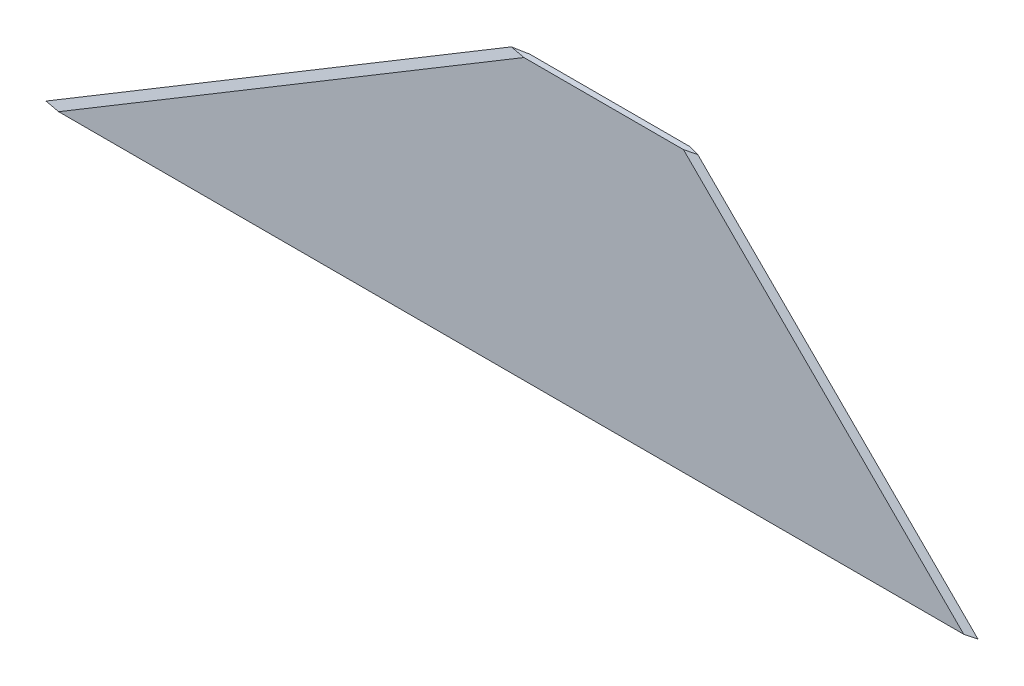
ISO-10303-21;
HEADER;
FILE_DESCRIPTION(('STEP AP214'),'2;1');
FILE_NAME('part.step','',(''),(''),'','','');
FILE_SCHEMA(('AUTOMOTIVE_DESIGN { 1 0 10303 214 1 1 1 1 }'));
ENDSEC;
DATA;
#1=APPLICATION_CONTEXT('core data for automotive mechanical design processes');
#2=APPLICATION_PROTOCOL_DEFINITION('international standard','automotive_design',2000,#1);
#3=PRODUCT_CONTEXT('',#1,'mechanical');
#4=PRODUCT('Part','Part','',(#3));
#5=PRODUCT_RELATED_PRODUCT_CATEGORY('part','',(#4));
#6=PRODUCT_DEFINITION_FORMATION('','',#4);
#7=PRODUCT_DEFINITION_CONTEXT('part definition',#1,'design');
#8=PRODUCT_DEFINITION('design','',#6,#7);
#9=PRODUCT_DEFINITION_SHAPE('','',#8);
#10=(LENGTH_UNIT() NAMED_UNIT(*) SI_UNIT(.MILLI.,.METRE.));
#11=(NAMED_UNIT(*) PLANE_ANGLE_UNIT() SI_UNIT($,.RADIAN.));
#12=(NAMED_UNIT(*) SI_UNIT($,.STERADIAN.) SOLID_ANGLE_UNIT());
#13=UNCERTAINTY_MEASURE_WITH_UNIT(LENGTH_MEASURE(1.E-05),#10,'distance_accuracy_value','');
#14=(GEOMETRIC_REPRESENTATION_CONTEXT(3) GLOBAL_UNCERTAINTY_ASSIGNED_CONTEXT((#13)) GLOBAL_UNIT_ASSIGNED_CONTEXT((#10,
#11,#12)) REPRESENTATION_CONTEXT('',''));
#15=CARTESIAN_POINT('',(0.,0.,0.));
#16=DIRECTION('',(0.,0.,1.));
#17=DIRECTION('',(1.,0.,0.));
#18=AXIS2_PLACEMENT_3D('',#15,#16,#17);
#19=CARTESIAN_POINT('',(-508.,0.,3.175));
#20=DIRECTION('',(0.,1.,0.));
#21=DIRECTION('',(0.,0.,1.));
#22=AXIS2_PLACEMENT_3D('',#19,#20,#21);
#23=PLANE('',#22);
#24=DIRECTION('',(0.968512561934584,0.,0.248964691020449));
#25=VECTOR('',#24,1.);
#26=CARTESIAN_POINT('',(0.,0.,1.58749999999999));
#27=LINE('',#26,#25);
#28=CARTESIAN_POINT('',(-6.17562950701656,0.,0.));
#29=VERTEX_POINT('',#28);
#30=CARTESIAN_POINT('',(0.,0.,1.58749999999999));
#31=VERTEX_POINT('',#30);
#32=EDGE_CURVE('E115',#29,#31,#27,.T.);
#33=ORIENTED_EDGE('',*,*,#32,.T.);
#34=DIRECTION('',(0.968512561934586,0.,-0.248964691020445));
#35=VECTOR('',#34,1.);
#36=CARTESIAN_POINT('',(-3.27230202513113,0.,2.42867407933771));
#37=LINE('',#36,#35);
#38=CARTESIAN_POINT('',(-6.17562950701678,0.,3.175));
#39=VERTEX_POINT('',#38);
#40=EDGE_CURVE('E11',#31,#39,#37,.F.);
#41=ORIENTED_EDGE('',*,*,#40,.T.);
#42=DIRECTION('',(1.,0.,0.));
#43=VECTOR('',#42,1.);
#44=CARTESIAN_POINT('',(-508.,0.,3.175));
#45=LINE('',#44,#43);
#46=CARTESIAN_POINT('',(-499.531460263116,0.,3.175));
#47=VERTEX_POINT('',#46);
#48=EDGE_CURVE('E105',#47,#39,#45,.T.);
#49=ORIENTED_EDGE('',*,*,#48,.F.);
#50=DIRECTION('',(0.982879569308805,0.,0.184249158031556));
#51=VECTOR('',#50,1.);
#52=CARTESIAN_POINT('',(-144.967449996436,0.,69.6410477232919));
#53=LINE('',#52,#51);
#54=CARTESIAN_POINT('',(-508.,0.,1.58749999999999));
#55=VERTEX_POINT('',#54);
#56=EDGE_CURVE('E41',#47,#55,#53,.F.);
#57=ORIENTED_EDGE('',*,*,#56,.T.);
#58=DIRECTION('',(0.982879569308805,0.,-0.184249158031557));
#59=VECTOR('',#58,1.);
#60=CARTESIAN_POINT('',(-262.974185531404,0.,-44.3446786936556));
#61=LINE('',#60,#59);
#62=CARTESIAN_POINT('',(-499.531460263116,0.,0.));
#63=VERTEX_POINT('',#62);
#64=EDGE_CURVE('E113',#55,#63,#61,.T.);
#65=ORIENTED_EDGE('',*,*,#64,.T.);
#66=DIRECTION('',(1.,0.,0.));
#67=VECTOR('',#66,1.);
#68=CARTESIAN_POINT('',(-508.,0.,0.));
#69=LINE('',#68,#67);
#70=EDGE_CURVE('E141',#63,#29,#69,.T.);
#71=ORIENTED_EDGE('',*,*,#70,.T.);
#72=EDGE_LOOP('',(#33,#41,#49,#57,#65,#71));
#73=FACE_BOUND('',#72,.T.);
#74=ADVANCED_FACE('F33',(#73),#23,.F.);
#75=CARTESIAN_POINT('',(-152.763806889784,152.4,3.175));
#76=DIRECTION('',(0.,-1.,0.));
#77=DIRECTION('',(1.,0.,0.));
#78=AXIS2_PLACEMENT_3D('',#75,#76,#77);
#79=PLANE('',#78);
#80=DIRECTION('',(-1.,0.,0.));
#81=VECTOR('',#80,1.);
#82=CARTESIAN_POINT('',(-152.763806889784,152.4,3.175));
#83=LINE('',#82,#81);
#84=CARTESIAN_POINT('',(-158.939436396801,152.4,3.175));
#85=VERTEX_POINT('',#84);
#86=CARTESIAN_POINT('',(-245.8952671529,152.4,3.175));
#87=VERTEX_POINT('',#86);
#88=EDGE_CURVE('E89',#85,#87,#83,.T.);
#89=ORIENTED_EDGE('',*,*,#88,.F.);
#90=DIRECTION('',(-0.968512561934586,0.,0.248964691020445));
#91=VECTOR('',#90,1.);
#92=CARTESIAN_POINT('',(-12.7411248273601,152.4,-34.4065646571395));
#93=LINE('',#92,#91);
#94=CARTESIAN_POINT('',(-152.763806889784,152.4,1.58749999999999));
#95=VERTEX_POINT('',#94);
#96=EDGE_CURVE('E56',#85,#95,#93,.F.);
#97=ORIENTED_EDGE('',*,*,#96,.T.);
#98=DIRECTION('',(-0.968512561934584,0.,-0.248964691020449));
#99=VECTOR('',#98,1.);
#100=CARTESIAN_POINT('',(-9.46882280222934,152.4,38.4227387364779));
#101=LINE('',#100,#99);
#102=CARTESIAN_POINT('',(-158.9394363968,152.4,0.));
#103=VERTEX_POINT('',#102);
#104=EDGE_CURVE('E87',#95,#103,#101,.T.);
#105=ORIENTED_EDGE('',*,*,#104,.T.);
#106=DIRECTION('',(-1.,0.,0.));
#107=VECTOR('',#106,1.);
#108=CARTESIAN_POINT('',(-152.763806889784,152.4,0.));
#109=LINE('',#108,#107);
#110=CARTESIAN_POINT('',(-245.8952671529,152.4,0.));
#111=VERTEX_POINT('',#110);
#112=EDGE_CURVE('E108',#103,#111,#109,.T.);
#113=ORIENTED_EDGE('',*,*,#112,.T.);
#114=DIRECTION('',(-0.982879569308805,0.,0.184249158031557));
#115=VECTOR('',#114,1.);
#116=CARTESIAN_POINT('',(-254.363806889784,152.4,1.58749999999999));
#117=LINE('',#116,#115);
#118=CARTESIAN_POINT('',(-254.363806889784,152.4,1.58749999999999));
#119=VERTEX_POINT('',#118);
#120=EDGE_CURVE('E100',#111,#119,#117,.T.);
#121=ORIENTED_EDGE('',*,*,#120,.T.);
#122=DIRECTION('',(-0.982879569308805,0.,-0.184249158031556));
#123=VECTOR('',#122,1.);
#124=CARTESIAN_POINT('',(-136.357071354817,152.4,23.7088690296365));
#125=LINE('',#124,#123);
#126=EDGE_CURVE('E48',#119,#87,#125,.F.);
#127=ORIENTED_EDGE('',*,*,#126,.T.);
#128=EDGE_LOOP('',(#89,#97,#105,#113,#121,#127));
#129=FACE_BOUND('',#128,.T.);
#130=ADVANCED_FACE('F85',(#129),#79,.F.);
#131=CARTESIAN_POINT('',(0.,0.,3.175));
#132=DIRECTION('',(0.,0.,-1.));
#133=DIRECTION('',(-1.,0.,0.));
#134=AXIS2_PLACEMENT_3D('',#131,#132,#133);
#135=PLANE('',#134);
#136=ORIENTED_EDGE('',*,*,#48,.T.);
#137=DIRECTION('',(-0.707949269015721,0.706263288370638,0.));
#138=VECTOR('',#137,1.);
#139=CARTESIAN_POINT('',(-3.08045236871875,-3.08780597630005,3.175));
#140=LINE('',#139,#138);
#141=EDGE_CURVE('E123',#39,#85,#140,.T.);
#142=ORIENTED_EDGE('',*,*,#141,.T.);
#143=ORIENTED_EDGE('',*,*,#88,.T.);
#144=DIRECTION('',(-0.85716730070211,-0.515038074910059,0.));
#145=VECTOR('',#144,1.);
#146=CARTESIAN_POINT('',(-132.507822476339,220.530050198313,3.175));
#147=LINE('',#146,#145);
#148=EDGE_CURVE('E120',#87,#47,#147,.T.);
#149=ORIENTED_EDGE('',*,*,#148,.T.);
#150=EDGE_LOOP('',(#136,#142,#143,#149));
#151=FACE_BOUND('',#150,.T.);
#152=ADVANCED_FACE('F139',(#151),#135,.F.);
#153=CARTESIAN_POINT('',(0.,0.,0.));
#154=DIRECTION('',(0.,0.,-1.));
#155=DIRECTION('',(-1.,0.,0.));
#156=AXIS2_PLACEMENT_3D('',#153,#154,#155);
#157=PLANE('',#156);
#158=ORIENTED_EDGE('',*,*,#112,.F.);
#159=DIRECTION('',(0.707949269015721,-0.706263288370638,0.));
#160=VECTOR('',#159,1.);
#161=CARTESIAN_POINT('',(-3.08045236871863,-3.08780597629993,0.));
#162=LINE('',#161,#160);
#163=EDGE_CURVE('E98',#103,#29,#162,.T.);
#164=ORIENTED_EDGE('',*,*,#163,.T.);
#165=ORIENTED_EDGE('',*,*,#70,.F.);
#166=DIRECTION('',(0.85716730070211,0.515038074910059,0.));
#167=VECTOR('',#166,1.);
#168=CARTESIAN_POINT('',(-252.117406313737,148.661361612144,0.));
#169=LINE('',#168,#167);
#170=EDGE_CURVE('E99',#63,#111,#169,.T.);
#171=ORIENTED_EDGE('',*,*,#170,.T.);
#172=EDGE_LOOP('',(#158,#164,#165,#171));
#173=FACE_BOUND('',#172,.T.);
#174=ADVANCED_FACE('F143',(#173),#157,.T.);
#175=CARTESIAN_POINT('',(0.,0.,1.58749999999999));
#176=DIRECTION('',(0.241556271114181,0.242132910456056,-0.93969262078591));
#177=DIRECTION('',(0.707949269015721,-0.706263288370638,0.));
#178=AXIS2_PLACEMENT_3D('',#175,#176,#177);
#179=PLANE('',#178);
#180=ORIENTED_EDGE('',*,*,#32,.F.);
#181=ORIENTED_EDGE('',*,*,#163,.F.);
#182=ORIENTED_EDGE('',*,*,#104,.F.);
#183=DIRECTION('',(-0.707949269015721,0.706263288370638,0.));
#184=VECTOR('',#183,1.);
#185=CARTESIAN_POINT('',(-152.763806889784,152.4,1.58749999999999));
#186=LINE('',#185,#184);
#187=EDGE_CURVE('E96',#31,#95,#186,.T.);
#188=ORIENTED_EDGE('',*,*,#187,.F.);
#189=EDGE_LOOP('',(#180,#181,#182,#188));
#190=FACE_BOUND('',#189,.T.);
#191=ADVANCED_FACE('F95',(#190),#179,.T.);
#192=CARTESIAN_POINT('',(-254.363806889784,152.4,1.58749999999999));
#193=DIRECTION('',(-0.176153396198913,0.293168483040209,-0.93969262078591));
#194=DIRECTION('',(0.85716730070211,0.515038074910059,0.));
#195=AXIS2_PLACEMENT_3D('',#192,#193,#194);
#196=PLANE('',#195);
#197=ORIENTED_EDGE('',*,*,#120,.F.);
#198=ORIENTED_EDGE('',*,*,#170,.F.);
#199=ORIENTED_EDGE('',*,*,#64,.F.);
#200=DIRECTION('',(-0.85716730070211,-0.515038074910059,0.));
#201=VECTOR('',#200,1.);
#202=CARTESIAN_POINT('',(-508.,0.,1.58749999999999));
#203=LINE('',#202,#201);
#204=EDGE_CURVE('E117',#119,#55,#203,.T.);
#205=ORIENTED_EDGE('',*,*,#204,.F.);
#206=EDGE_LOOP('',(#197,#198,#199,#205));
#207=FACE_BOUND('',#206,.T.);
#208=ADVANCED_FACE('F137',(#207),#196,.T.);
#209=CARTESIAN_POINT('',(-3.08045236871874,-3.08780597630004,3.175));
#210=DIRECTION('',(-0.241556271114177,-0.242132910456052,-0.939692620785912));
#211=DIRECTION('',(-0.707949269015721,0.706263288370638,0.));
#212=AXIS2_PLACEMENT_3D('',#209,#210,#211);
#213=PLANE('',#212);
#214=ORIENTED_EDGE('',*,*,#40,.F.);
#215=ORIENTED_EDGE('',*,*,#187,.T.);
#216=ORIENTED_EDGE('',*,*,#96,.F.);
#217=ORIENTED_EDGE('',*,*,#141,.F.);
#218=EDGE_LOOP('',(#214,#215,#216,#217));
#219=FACE_BOUND('',#218,.T.);
#220=ADVANCED_FACE('F102',(#219),#213,.F.);
#221=CARTESIAN_POINT('',(-132.507822476339,220.530050198313,3.175));
#222=DIRECTION('',(0.176153396198912,-0.293168483040208,-0.93969262078591));
#223=DIRECTION('',(-0.85716730070211,-0.515038074910059,0.));
#224=AXIS2_PLACEMENT_3D('',#221,#222,#223);
#225=PLANE('',#224);
#226=ORIENTED_EDGE('',*,*,#126,.F.);
#227=ORIENTED_EDGE('',*,*,#204,.T.);
#228=ORIENTED_EDGE('',*,*,#56,.F.);
#229=ORIENTED_EDGE('',*,*,#148,.F.);
#230=EDGE_LOOP('',(#226,#227,#228,#229));
#231=FACE_BOUND('',#230,.T.);
#232=ADVANCED_FACE('F35',(#231),#225,.F.);
#233=CLOSED_SHELL('',(#74,#130,#152,#174,#191,#208,#220,#232));
#234=MANIFOLD_SOLID_BREP('B2',#233);
#235=ADVANCED_BREP_SHAPE_REPRESENTATION('',(#18,#234),#14);
#236=SHAPE_DEFINITION_REPRESENTATION(#9,#235);
ENDSEC;
END-ISO-10303-21;
